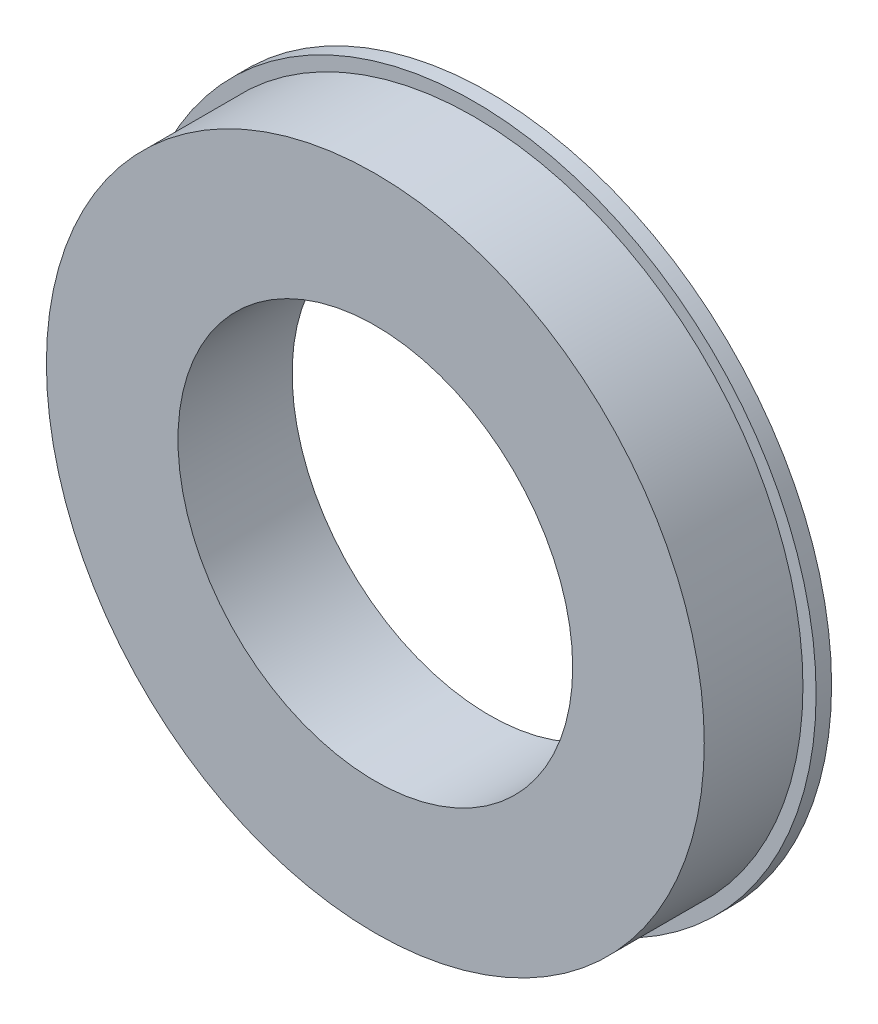
ISO-10303-21;
HEADER;
FILE_DESCRIPTION(('STEP AP214'),'2;1');
FILE_NAME('part.step','',(''),(''),'','','');
FILE_SCHEMA(('AUTOMOTIVE_DESIGN { 1 0 10303 214 1 1 1 1 }'));
ENDSEC;
DATA;
#1=APPLICATION_CONTEXT('core data for automotive mechanical design processes');
#2=APPLICATION_PROTOCOL_DEFINITION('international standard','automotive_design',2000,#1);
#3=PRODUCT_CONTEXT('',#1,'mechanical');
#4=PRODUCT('Part','Part','',(#3));
#5=PRODUCT_RELATED_PRODUCT_CATEGORY('part','',(#4));
#6=PRODUCT_DEFINITION_FORMATION('','',#4);
#7=PRODUCT_DEFINITION_CONTEXT('part definition',#1,'design');
#8=PRODUCT_DEFINITION('design','',#6,#7);
#9=PRODUCT_DEFINITION_SHAPE('','',#8);
#10=(LENGTH_UNIT() NAMED_UNIT(*) SI_UNIT(.MILLI.,.METRE.));
#11=(NAMED_UNIT(*) PLANE_ANGLE_UNIT() SI_UNIT($,.RADIAN.));
#12=(NAMED_UNIT(*) SI_UNIT($,.STERADIAN.) SOLID_ANGLE_UNIT());
#13=UNCERTAINTY_MEASURE_WITH_UNIT(LENGTH_MEASURE(1.E-05),#10,'distance_accuracy_value','');
#14=(GEOMETRIC_REPRESENTATION_CONTEXT(3) GLOBAL_UNCERTAINTY_ASSIGNED_CONTEXT((#13)) GLOBAL_UNIT_ASSIGNED_CONTEXT((#10,
#11,#12)) REPRESENTATION_CONTEXT('',''));
#15=CARTESIAN_POINT('',(0.,0.,0.));
#16=DIRECTION('',(0.,0.,1.));
#17=DIRECTION('',(1.,0.,0.));
#18=AXIS2_PLACEMENT_3D('',#15,#16,#17);
#19=CARTESIAN_POINT('',(0.,0.,105.875247524752));
#20=DIRECTION('',(0.,0.,1.));
#21=DIRECTION('',(1.,0.,0.));
#22=AXIS2_PLACEMENT_3D('',#19,#20,#21);
#23=CYLINDRICAL_SURFACE('',#22,66.04);
#24=CARTESIAN_POINT('',(0.,0.,-19.05));
#25=DIRECTION('',(0.,0.,1.));
#26=DIRECTION('',(1.,0.,0.));
#27=AXIS2_PLACEMENT_3D('',#24,#25,#26);
#28=CIRCLE('',#27,66.04);
#29=CARTESIAN_POINT('',(66.04,0.,-19.05));
#30=VERTEX_POINT('',#29);
#31=EDGE_CURVE('E51',#30,#30,#28,.T.);
#32=ORIENTED_EDGE('',*,*,#31,.F.);
#33=EDGE_LOOP('',(#32));
#34=FACE_BOUND('',#33,.T.);
#35=CARTESIAN_POINT('',(0.,0.,-22.04));
#36=DIRECTION('',(0.,0.,1.));
#37=DIRECTION('',(1.,0.,0.));
#38=AXIS2_PLACEMENT_3D('',#35,#36,#37);
#39=CIRCLE('',#38,66.04);
#40=CARTESIAN_POINT('',(66.04,0.,-22.04));
#41=VERTEX_POINT('',#40);
#42=EDGE_CURVE('E46',#41,#41,#39,.T.);
#43=ORIENTED_EDGE('',*,*,#42,.T.);
#44=EDGE_LOOP('',(#43));
#45=FACE_BOUND('',#44,.T.);
#46=ADVANCED_FACE('F38',(#34,#45),#23,.T.);
#47=CARTESIAN_POINT('',(0.,-1.20419859560719E-13,-22.04));
#48=DIRECTION('',(0.,0.,1.));
#49=DIRECTION('',(1.,0.,0.));
#50=AXIS2_PLACEMENT_3D('',#47,#48,#49);
#51=PLANE('',#50);
#52=ORIENTED_EDGE('',*,*,#42,.F.);
#53=EDGE_LOOP('',(#52));
#54=FACE_BOUND('',#53,.T.);
#55=CARTESIAN_POINT('',(0.,0.,-22.04));
#56=DIRECTION('',(0.,0.,1.));
#57=DIRECTION('',(1.,0.,0.));
#58=AXIS2_PLACEMENT_3D('',#55,#56,#57);
#59=CIRCLE('',#58,38.1);
#60=CARTESIAN_POINT('',(38.1,0.,-22.04));
#61=VERTEX_POINT('',#60);
#62=EDGE_CURVE('E42',#61,#61,#59,.T.);
#63=ORIENTED_EDGE('',*,*,#62,.T.);
#64=EDGE_LOOP('',(#63));
#65=FACE_BOUND('',#64,.T.);
#66=ADVANCED_FACE('F72',(#54,#65),#51,.F.);
#67=CARTESIAN_POINT('',(0.,0.,-19.05));
#68=DIRECTION('',(0.,0.,1.));
#69=DIRECTION('',(1.,0.,0.));
#70=AXIS2_PLACEMENT_3D('',#67,#68,#69);
#71=PLANE('',#70);
#72=ORIENTED_EDGE('',*,*,#31,.T.);
#73=EDGE_LOOP('',(#72));
#74=FACE_BOUND('',#73,.T.);
#75=CARTESIAN_POINT('',(0.,0.,-19.05));
#76=DIRECTION('',(0.,0.,1.));
#77=DIRECTION('',(1.,0.,0.));
#78=AXIS2_PLACEMENT_3D('',#75,#76,#77);
#79=CIRCLE('',#78,63.5);
#80=CARTESIAN_POINT('',(63.5,0.,-19.05));
#81=VERTEX_POINT('',#80);
#82=EDGE_CURVE('E10',#81,#81,#79,.T.);
#83=ORIENTED_EDGE('',*,*,#82,.F.);
#84=EDGE_LOOP('',(#83));
#85=FACE_BOUND('',#84,.T.);
#86=ADVANCED_FACE('F67',(#74,#85),#71,.T.);
#87=CARTESIAN_POINT('',(0.,38.1,0.));
#88=DIRECTION('',(0.,0.,1.));
#89=DIRECTION('',(1.,0.,0.));
#90=AXIS2_PLACEMENT_3D('',#87,#88,#89);
#91=PLANE('',#90);
#92=CARTESIAN_POINT('',(0.,0.,0.));
#93=DIRECTION('',(0.,0.,1.));
#94=DIRECTION('',(1.,0.,0.));
#95=AXIS2_PLACEMENT_3D('',#92,#93,#94);
#96=CIRCLE('',#95,63.5);
#97=CARTESIAN_POINT('',(63.5,0.,0.));
#98=VERTEX_POINT('',#97);
#99=EDGE_CURVE('E55',#98,#98,#96,.T.);
#100=ORIENTED_EDGE('',*,*,#99,.T.);
#101=EDGE_LOOP('',(#100));
#102=FACE_BOUND('',#101,.T.);
#103=CARTESIAN_POINT('',(0.,0.,0.));
#104=DIRECTION('',(0.,0.,1.));
#105=DIRECTION('',(1.,0.,0.));
#106=AXIS2_PLACEMENT_3D('',#103,#104,#105);
#107=CIRCLE('',#106,38.1);
#108=CARTESIAN_POINT('',(38.1,0.,0.));
#109=VERTEX_POINT('',#108);
#110=EDGE_CURVE('E57',#109,#109,#107,.T.);
#111=ORIENTED_EDGE('',*,*,#110,.F.);
#112=EDGE_LOOP('',(#111));
#113=FACE_BOUND('',#112,.T.);
#114=ADVANCED_FACE('F81',(#102,#113),#91,.T.);
#115=CARTESIAN_POINT('',(0.,0.,105.875247524752));
#116=DIRECTION('',(0.,0.,1.));
#117=DIRECTION('',(1.,0.,0.));
#118=AXIS2_PLACEMENT_3D('',#115,#116,#117);
#119=CYLINDRICAL_SURFACE('',#118,63.5);
#120=ORIENTED_EDGE('',*,*,#82,.T.);
#121=EDGE_LOOP('',(#120));
#122=FACE_BOUND('',#121,.T.);
#123=ORIENTED_EDGE('',*,*,#99,.F.);
#124=EDGE_LOOP('',(#123));
#125=FACE_BOUND('',#124,.T.);
#126=ADVANCED_FACE('F84',(#122,#125),#119,.T.);
#127=CARTESIAN_POINT('',(0.,0.,105.875247524752));
#128=DIRECTION('',(0.,0.,1.));
#129=DIRECTION('',(1.,0.,0.));
#130=AXIS2_PLACEMENT_3D('',#127,#128,#129);
#131=CYLINDRICAL_SURFACE('',#130,38.1);
#132=ORIENTED_EDGE('',*,*,#62,.F.);
#133=EDGE_LOOP('',(#132));
#134=FACE_BOUND('',#133,.T.);
#135=ORIENTED_EDGE('',*,*,#110,.T.);
#136=EDGE_LOOP('',(#135));
#137=FACE_BOUND('',#136,.T.);
#138=ADVANCED_FACE('F40',(#134,#137),#131,.F.);
#139=CLOSED_SHELL('',(#46,#66,#86,#114,#126,#138));
#140=MANIFOLD_SOLID_BREP('B2',#139);
#141=ADVANCED_BREP_SHAPE_REPRESENTATION('',(#18,#140),#14);
#142=SHAPE_DEFINITION_REPRESENTATION(#9,#141);
ENDSEC;
END-ISO-10303-21;
